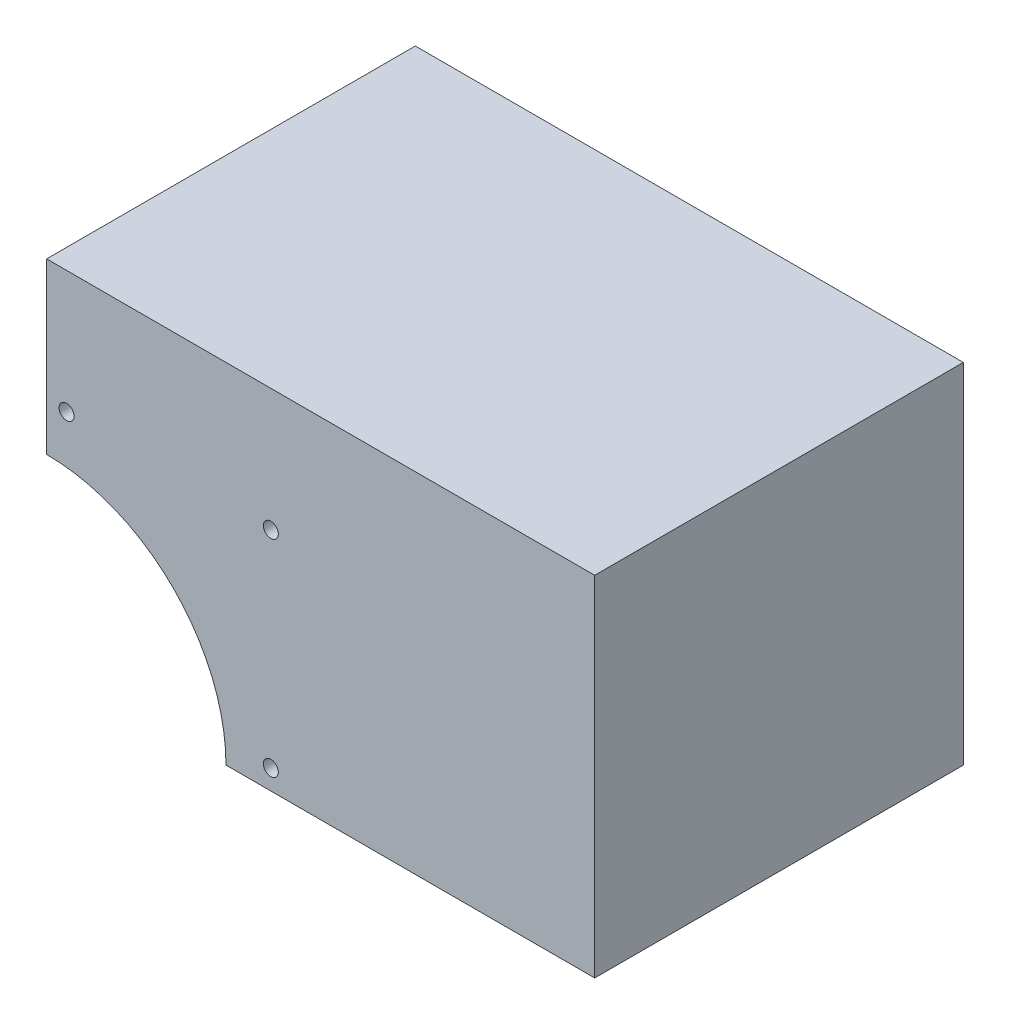
ISO-10303-21;
HEADER;
FILE_DESCRIPTION(('STEP AP214'),'2;1');
FILE_NAME('part.step','',(''),(''),'','','');
FILE_SCHEMA(('AUTOMOTIVE_DESIGN { 1 0 10303 214 1 1 1 1 }'));
ENDSEC;
DATA;
#1=APPLICATION_CONTEXT('core data for automotive mechanical design processes');
#2=APPLICATION_PROTOCOL_DEFINITION('international standard','automotive_design',2000,#1);
#3=PRODUCT_CONTEXT('',#1,'mechanical');
#4=PRODUCT('Part','Part','',(#3));
#5=PRODUCT_RELATED_PRODUCT_CATEGORY('part','',(#4));
#6=PRODUCT_DEFINITION_FORMATION('','',#4);
#7=PRODUCT_DEFINITION_CONTEXT('part definition',#1,'design');
#8=PRODUCT_DEFINITION('design','',#6,#7);
#9=PRODUCT_DEFINITION_SHAPE('','',#8);
#10=(LENGTH_UNIT() NAMED_UNIT(*) SI_UNIT(.MILLI.,.METRE.));
#11=(NAMED_UNIT(*) PLANE_ANGLE_UNIT() SI_UNIT($,.RADIAN.));
#12=(NAMED_UNIT(*) SI_UNIT($,.STERADIAN.) SOLID_ANGLE_UNIT());
#13=UNCERTAINTY_MEASURE_WITH_UNIT(LENGTH_MEASURE(1.E-05),#10,'distance_accuracy_value','');
#14=(GEOMETRIC_REPRESENTATION_CONTEXT(3) GLOBAL_UNCERTAINTY_ASSIGNED_CONTEXT((#13)) GLOBAL_UNIT_ASSIGNED_CONTEXT((#10,
#11,#12)) REPRESENTATION_CONTEXT('',''));
#15=CARTESIAN_POINT('',(0.,0.,0.));
#16=DIRECTION('',(0.,0.,1.));
#17=DIRECTION('',(1.,0.,0.));
#18=AXIS2_PLACEMENT_3D('',#15,#16,#17);
#19=CARTESIAN_POINT('',(0.,0.,37.));
#20=DIRECTION('',(0.,1.,0.));
#21=DIRECTION('',(0.,0.,1.));
#22=AXIS2_PLACEMENT_3D('',#19,#20,#21);
#23=PLANE('',#22);
#24=DIRECTION('',(1.,0.,0.));
#25=VECTOR('',#24,1.);
#26=CARTESIAN_POINT('',(0.,0.,37.));
#27=LINE('',#26,#25);
#28=CARTESIAN_POINT('',(18.,0.,37.));
#29=VERTEX_POINT('',#28);
#30=CARTESIAN_POINT('',(55.,0.,37.));
#31=VERTEX_POINT('',#30);
#32=EDGE_CURVE('E183',#29,#31,#27,.T.);
#33=ORIENTED_EDGE('',*,*,#32,.F.);
#34=DIRECTION('',(0.,0.,1.));
#35=VECTOR('',#34,1.);
#36=CARTESIAN_POINT('',(18.,0.,0.));
#37=LINE('',#36,#35);
#38=CARTESIAN_POINT('',(18.,0.,36.));
#39=VERTEX_POINT('',#38);
#40=EDGE_CURVE('E155',#29,#39,#37,.F.);
#41=ORIENTED_EDGE('',*,*,#40,.T.);
#42=DIRECTION('',(1.,0.,0.));
#43=VECTOR('',#42,1.);
#44=CARTESIAN_POINT('',(0.,0.,36.));
#45=LINE('',#44,#43);
#46=CARTESIAN_POINT('',(20.75,0.,36.));
#47=VERTEX_POINT('',#46);
#48=EDGE_CURVE('E250',#39,#47,#45,.T.);
#49=ORIENTED_EDGE('',*,*,#48,.T.);
#50=DIRECTION('',(0.,0.,-1.));
#51=VECTOR('',#50,1.);
#52=CARTESIAN_POINT('',(20.75,0.,0.));
#53=LINE('',#52,#51);
#54=CARTESIAN_POINT('',(20.75,0.,34.5));
#55=VERTEX_POINT('',#54);
#56=EDGE_CURVE('E153',#47,#55,#53,.T.);
#57=ORIENTED_EDGE('',*,*,#56,.T.);
#58=DIRECTION('',(-1.,0.,0.));
#59=VECTOR('',#58,1.);
#60=CARTESIAN_POINT('',(0.,0.,34.5));
#61=LINE('',#60,#59);
#62=CARTESIAN_POINT('',(26.,0.,34.5));
#63=VERTEX_POINT('',#62);
#64=EDGE_CURVE('E219',#63,#55,#61,.T.);
#65=ORIENTED_EDGE('',*,*,#64,.F.);
#66=DIRECTION('',(0.,0.,1.));
#67=VECTOR('',#66,1.);
#68=CARTESIAN_POINT('',(26.,0.,34.5));
#69=LINE('',#68,#67);
#70=CARTESIAN_POINT('',(26.,0.,2.5));
#71=VERTEX_POINT('',#70);
#72=EDGE_CURVE('E225',#71,#63,#69,.T.);
#73=ORIENTED_EDGE('',*,*,#72,.F.);
#74=DIRECTION('',(1.,0.,0.));
#75=VECTOR('',#74,1.);
#76=CARTESIAN_POINT('',(0.,0.,2.5));
#77=LINE('',#76,#75);
#78=CARTESIAN_POINT('',(18.,0.,2.5));
#79=VERTEX_POINT('',#78);
#80=EDGE_CURVE('E152',#79,#71,#77,.T.);
#81=ORIENTED_EDGE('',*,*,#80,.F.);
#82=CARTESIAN_POINT('',(18.,0.,0.));
#83=VERTEX_POINT('',#82);
#84=EDGE_CURVE('E52',#79,#83,#37,.F.);
#85=ORIENTED_EDGE('',*,*,#84,.T.);
#86=DIRECTION('',(1.,0.,0.));
#87=VECTOR('',#86,1.);
#88=CARTESIAN_POINT('',(0.,0.,0.));
#89=LINE('',#88,#87);
#90=CARTESIAN_POINT('',(55.,0.,0.));
#91=VERTEX_POINT('',#90);
#92=EDGE_CURVE('E149',#83,#91,#89,.T.);
#93=ORIENTED_EDGE('',*,*,#92,.T.);
#94=DIRECTION('',(0.,0.,-1.));
#95=VECTOR('',#94,1.);
#96=CARTESIAN_POINT('',(55.,0.,37.));
#97=LINE('',#96,#95);
#98=EDGE_CURVE('E45',#31,#91,#97,.T.);
#99=ORIENTED_EDGE('',*,*,#98,.F.);
#100=EDGE_LOOP('',(#33,#41,#49,#57,#65,#73,#81,#85,#93,#99));
#101=FACE_BOUND('',#100,.T.);
#102=ADVANCED_FACE('F37',(#101),#23,.F.);
#103=CARTESIAN_POINT('',(0.,76.2310562561766,34.5));
#104=DIRECTION('',(0.,0.,1.));
#105=DIRECTION('',(1.,0.,0.));
#106=AXIS2_PLACEMENT_3D('',#103,#104,#105);
#107=PLANE('',#106);
#108=CARTESIAN_POINT('',(22.5,2.,34.5));
#109=DIRECTION('',(0.,0.,1.));
#110=DIRECTION('',(1.,0.,0.));
#111=AXIS2_PLACEMENT_3D('',#108,#109,#110);
#112=CIRCLE('',#111,0.750000000000002);
#113=CARTESIAN_POINT('',(23.25,2.,34.5));
#114=VERTEX_POINT('',#113);
#115=EDGE_CURVE('E236',#114,#114,#112,.F.);
#116=ORIENTED_EDGE('',*,*,#115,.F.);
#117=EDGE_LOOP('',(#116));
#118=FACE_BOUND('',#117,.T.);
#119=CARTESIAN_POINT('',(22.5,22.7,34.5));
#120=DIRECTION('',(0.,0.,1.));
#121=DIRECTION('',(1.,0.,0.));
#122=AXIS2_PLACEMENT_3D('',#119,#120,#121);
#123=CIRCLE('',#122,0.750000000000002);
#124=CARTESIAN_POINT('',(23.25,22.7,34.5));
#125=VERTEX_POINT('',#124);
#126=EDGE_CURVE('E292',#125,#125,#123,.F.);
#127=ORIENTED_EDGE('',*,*,#126,.F.);
#128=EDGE_LOOP('',(#127));
#129=FACE_BOUND('',#128,.T.);
#130=CARTESIAN_POINT('',(2.,22.7,34.5));
#131=DIRECTION('',(0.,0.,1.));
#132=DIRECTION('',(1.,0.,0.));
#133=AXIS2_PLACEMENT_3D('',#130,#131,#132);
#134=CIRCLE('',#133,0.75);
#135=CARTESIAN_POINT('',(2.75,22.7,34.5));
#136=VERTEX_POINT('',#135);
#137=EDGE_CURVE('E298',#136,#136,#134,.F.);
#138=ORIENTED_EDGE('',*,*,#137,.F.);
#139=EDGE_LOOP('',(#138));
#140=FACE_BOUND('',#139,.T.);
#141=DIRECTION('',(0.,-1.,0.));
#142=VECTOR('',#141,1.);
#143=CARTESIAN_POINT('',(3.75,27.,34.5));
#144=LINE('',#143,#142);
#145=CARTESIAN_POINT('',(3.75,27.,34.5));
#146=VERTEX_POINT('',#145);
#147=CARTESIAN_POINT('',(3.75,17.6050418914583,34.5));
#148=VERTEX_POINT('',#147);
#149=EDGE_CURVE('E264',#146,#148,#144,.T.);
#150=ORIENTED_EDGE('',*,*,#149,.T.);
#151=CARTESIAN_POINT('',(0.,0.,34.5));
#152=DIRECTION('',(0.,0.,1.));
#153=DIRECTION('',(1.,0.,0.));
#154=AXIS2_PLACEMENT_3D('',#151,#152,#153);
#155=CIRCLE('',#154,18.);
#156=CARTESIAN_POINT('',(0.,18.,34.5));
#157=VERTEX_POINT('',#156);
#158=EDGE_CURVE('E209',#148,#157,#155,.T.);
#159=ORIENTED_EDGE('',*,*,#158,.T.);
#160=DIRECTION('',(0.,-1.,0.));
#161=VECTOR('',#160,1.);
#162=CARTESIAN_POINT('',(0.,76.2310562561766,34.5));
#163=LINE('',#162,#161);
#164=CARTESIAN_POINT('',(0.,32.,34.5));
#165=VERTEX_POINT('',#164);
#166=EDGE_CURVE('E204',#165,#157,#163,.T.);
#167=ORIENTED_EDGE('',*,*,#166,.F.);
#168=DIRECTION('',(1.,0.,0.));
#169=VECTOR('',#168,1.);
#170=CARTESIAN_POINT('',(0.,32.,34.5));
#171=LINE('',#170,#169);
#172=CARTESIAN_POINT('',(26.,32.,34.5));
#173=VERTEX_POINT('',#172);
#174=EDGE_CURVE('E229',#165,#173,#171,.T.);
#175=ORIENTED_EDGE('',*,*,#174,.T.);
#176=DIRECTION('',(0.,-1.,0.));
#177=VECTOR('',#176,1.);
#178=CARTESIAN_POINT('',(26.,76.2310562561766,34.5));
#179=LINE('',#178,#177);
#180=EDGE_CURVE('E222',#173,#63,#179,.T.);
#181=ORIENTED_EDGE('',*,*,#180,.T.);
#182=ORIENTED_EDGE('',*,*,#64,.T.);
#183=DIRECTION('',(0.,-1.,0.));
#184=VECTOR('',#183,1.);
#185=CARTESIAN_POINT('',(20.75,27.,34.5));
#186=LINE('',#185,#184);
#187=CARTESIAN_POINT('',(20.75,27.,34.5));
#188=VERTEX_POINT('',#187);
#189=EDGE_CURVE('E261',#188,#55,#186,.T.);
#190=ORIENTED_EDGE('',*,*,#189,.F.);
#191=DIRECTION('',(1.,0.,0.));
#192=VECTOR('',#191,1.);
#193=CARTESIAN_POINT('',(0.,27.,34.5));
#194=LINE('',#193,#192);
#195=EDGE_CURVE('E258',#146,#188,#194,.T.);
#196=ORIENTED_EDGE('',*,*,#195,.F.);
#197=EDGE_LOOP('',(#150,#159,#167,#175,#181,#182,#190,#196));
#198=FACE_BOUND('',#197,.T.);
#199=ADVANCED_FACE('F242',(#118,#129,#140,#198),#107,.F.);
#200=CARTESIAN_POINT('',(0.,0.,37.));
#201=DIRECTION('',(1.,0.,0.));
#202=DIRECTION('',(0.,0.,-1.));
#203=AXIS2_PLACEMENT_3D('',#200,#201,#202);
#204=PLANE('',#203);
#205=DIRECTION('',(0.,-1.,0.));
#206=VECTOR('',#205,1.);
#207=CARTESIAN_POINT('',(0.,0.,0.));
#208=LINE('',#207,#206);
#209=CARTESIAN_POINT('',(0.,35.,0.));
#210=VERTEX_POINT('',#209);
#211=CARTESIAN_POINT('',(0.,18.,0.));
#212=VERTEX_POINT('',#211);
#213=EDGE_CURVE('E161',#210,#212,#208,.T.);
#214=ORIENTED_EDGE('',*,*,#213,.T.);
#215=DIRECTION('',(0.,0.,1.));
#216=VECTOR('',#215,1.);
#217=CARTESIAN_POINT('',(0.,18.,0.));
#218=LINE('',#217,#216);
#219=CARTESIAN_POINT('',(0.,18.,2.5));
#220=VERTEX_POINT('',#219);
#221=EDGE_CURVE('E138',#212,#220,#218,.T.);
#222=ORIENTED_EDGE('',*,*,#221,.T.);
#223=DIRECTION('',(0.,-1.,0.));
#224=VECTOR('',#223,1.);
#225=CARTESIAN_POINT('',(0.,76.2310562561766,2.5));
#226=LINE('',#225,#224);
#227=CARTESIAN_POINT('',(0.,32.,2.5));
#228=VERTEX_POINT('',#227);
#229=EDGE_CURVE('E212',#228,#220,#226,.T.);
#230=ORIENTED_EDGE('',*,*,#229,.F.);
#231=DIRECTION('',(0.,0.,1.));
#232=VECTOR('',#231,1.);
#233=CARTESIAN_POINT('',(0.,32.,34.5));
#234=LINE('',#233,#232);
#235=EDGE_CURVE('E228',#228,#165,#234,.T.);
#236=ORIENTED_EDGE('',*,*,#235,.T.);
#237=ORIENTED_EDGE('',*,*,#166,.T.);
#238=CARTESIAN_POINT('',(0.,18.,37.));
#239=VERTEX_POINT('',#238);
#240=EDGE_CURVE('E201',#157,#239,#218,.T.);
#241=ORIENTED_EDGE('',*,*,#240,.T.);
#242=DIRECTION('',(0.,-1.,0.));
#243=VECTOR('',#242,1.);
#244=CARTESIAN_POINT('',(0.,0.,37.));
#245=LINE('',#244,#243);
#246=CARTESIAN_POINT('',(0.,35.,37.));
#247=VERTEX_POINT('',#246);
#248=EDGE_CURVE('E170',#247,#239,#245,.T.);
#249=ORIENTED_EDGE('',*,*,#248,.F.);
#250=DIRECTION('',(0.,0.,-1.));
#251=VECTOR('',#250,1.);
#252=CARTESIAN_POINT('',(0.,35.,37.));
#253=LINE('',#252,#251);
#254=EDGE_CURVE('E171',#247,#210,#253,.T.);
#255=ORIENTED_EDGE('',*,*,#254,.T.);
#256=EDGE_LOOP('',(#214,#222,#230,#236,#237,#241,#249,#255));
#257=FACE_BOUND('',#256,.T.);
#258=ADVANCED_FACE('F39',(#257),#204,.F.);
#259=CARTESIAN_POINT('',(55.,0.,37.));
#260=DIRECTION('',(-1.,0.,0.));
#261=DIRECTION('',(0.,0.,1.));
#262=AXIS2_PLACEMENT_3D('',#259,#260,#261);
#263=PLANE('',#262);
#264=DIRECTION('',(0.,1.,0.));
#265=VECTOR('',#264,1.);
#266=CARTESIAN_POINT('',(55.,0.,0.));
#267=LINE('',#266,#265);
#268=CARTESIAN_POINT('',(55.,35.,0.));
#269=VERTEX_POINT('',#268);
#270=EDGE_CURVE('E160',#91,#269,#267,.T.);
#271=ORIENTED_EDGE('',*,*,#270,.T.);
#272=DIRECTION('',(0.,0.,-1.));
#273=VECTOR('',#272,1.);
#274=CARTESIAN_POINT('',(55.,35.,37.));
#275=LINE('',#274,#273);
#276=CARTESIAN_POINT('',(55.,35.,37.));
#277=VERTEX_POINT('',#276);
#278=EDGE_CURVE('E174',#277,#269,#275,.T.);
#279=ORIENTED_EDGE('',*,*,#278,.F.);
#280=DIRECTION('',(0.,1.,0.));
#281=VECTOR('',#280,1.);
#282=CARTESIAN_POINT('',(55.,0.,37.));
#283=LINE('',#282,#281);
#284=EDGE_CURVE('E181',#31,#277,#283,.T.);
#285=ORIENTED_EDGE('',*,*,#284,.F.);
#286=ORIENTED_EDGE('',*,*,#98,.T.);
#287=EDGE_LOOP('',(#271,#279,#285,#286));
#288=FACE_BOUND('',#287,.T.);
#289=ADVANCED_FACE('F179',(#288),#263,.F.);
#290=CARTESIAN_POINT('',(0.,35.,37.));
#291=DIRECTION('',(0.,-1.,0.));
#292=DIRECTION('',(0.,0.,-1.));
#293=AXIS2_PLACEMENT_3D('',#290,#291,#292);
#294=PLANE('',#293);
#295=DIRECTION('',(-1.,0.,0.));
#296=VECTOR('',#295,1.);
#297=CARTESIAN_POINT('',(0.,35.,0.));
#298=LINE('',#297,#296);
#299=EDGE_CURVE('E163',#269,#210,#298,.T.);
#300=ORIENTED_EDGE('',*,*,#299,.T.);
#301=ORIENTED_EDGE('',*,*,#254,.F.);
#302=DIRECTION('',(-1.,0.,0.));
#303=VECTOR('',#302,1.);
#304=CARTESIAN_POINT('',(0.,35.,37.));
#305=LINE('',#304,#303);
#306=EDGE_CURVE('E175',#277,#247,#305,.T.);
#307=ORIENTED_EDGE('',*,*,#306,.F.);
#308=ORIENTED_EDGE('',*,*,#278,.T.);
#309=EDGE_LOOP('',(#300,#301,#307,#308));
#310=FACE_BOUND('',#309,.T.);
#311=ADVANCED_FACE('F197',(#310),#294,.F.);
#312=CARTESIAN_POINT('',(0.,0.,37.));
#313=DIRECTION('',(0.,0.,-1.));
#314=DIRECTION('',(-1.,0.,0.));
#315=AXIS2_PLACEMENT_3D('',#312,#313,#314);
#316=PLANE('',#315);
#317=CARTESIAN_POINT('',(2.,22.7,37.));
#318=DIRECTION('',(0.,0.,1.));
#319=DIRECTION('',(1.,0.,0.));
#320=AXIS2_PLACEMENT_3D('',#317,#318,#319);
#321=CIRCLE('',#320,0.75);
#322=CARTESIAN_POINT('',(2.75,22.7,37.));
#323=VERTEX_POINT('',#322);
#324=EDGE_CURVE('E288',#323,#323,#321,.T.);
#325=ORIENTED_EDGE('',*,*,#324,.F.);
#326=EDGE_LOOP('',(#325));
#327=FACE_BOUND('',#326,.T.);
#328=CARTESIAN_POINT('',(22.5,22.7,37.));
#329=DIRECTION('',(0.,0.,1.));
#330=DIRECTION('',(1.,0.,0.));
#331=AXIS2_PLACEMENT_3D('',#328,#329,#330);
#332=CIRCLE('',#331,0.750000000000002);
#333=CARTESIAN_POINT('',(23.25,22.7,37.));
#334=VERTEX_POINT('',#333);
#335=EDGE_CURVE('E295',#334,#334,#332,.T.);
#336=ORIENTED_EDGE('',*,*,#335,.F.);
#337=EDGE_LOOP('',(#336));
#338=FACE_BOUND('',#337,.T.);
#339=CARTESIAN_POINT('',(22.5,2.,37.));
#340=DIRECTION('',(0.,0.,1.));
#341=DIRECTION('',(1.,0.,0.));
#342=AXIS2_PLACEMENT_3D('',#339,#340,#341);
#343=CIRCLE('',#342,0.750000000000002);
#344=CARTESIAN_POINT('',(23.25,2.,37.));
#345=VERTEX_POINT('',#344);
#346=EDGE_CURVE('E289',#345,#345,#343,.T.);
#347=ORIENTED_EDGE('',*,*,#346,.F.);
#348=EDGE_LOOP('',(#347));
#349=FACE_BOUND('',#348,.T.);
#350=ORIENTED_EDGE('',*,*,#248,.T.);
#351=CARTESIAN_POINT('',(0.,0.,37.));
#352=DIRECTION('',(0.,0.,1.));
#353=DIRECTION('',(1.,0.,0.));
#354=AXIS2_PLACEMENT_3D('',#351,#352,#353);
#355=CIRCLE('',#354,18.);
#356=EDGE_CURVE('E143',#29,#239,#355,.T.);
#357=ORIENTED_EDGE('',*,*,#356,.F.);
#358=ORIENTED_EDGE('',*,*,#32,.T.);
#359=ORIENTED_EDGE('',*,*,#284,.T.);
#360=ORIENTED_EDGE('',*,*,#306,.T.);
#361=EDGE_LOOP('',(#350,#357,#358,#359,#360));
#362=FACE_BOUND('',#361,.T.);
#363=ADVANCED_FACE('F194',(#327,#338,#349,#362),#316,.F.);
#364=CARTESIAN_POINT('',(0.,0.,0.));
#365=DIRECTION('',(0.,0.,-1.));
#366=DIRECTION('',(-1.,0.,0.));
#367=AXIS2_PLACEMENT_3D('',#364,#365,#366);
#368=PLANE('',#367);
#369=CARTESIAN_POINT('',(0.,0.,0.));
#370=DIRECTION('',(0.,0.,1.));
#371=DIRECTION('',(1.,0.,0.));
#372=AXIS2_PLACEMENT_3D('',#369,#370,#371);
#373=CIRCLE('',#372,18.);
#374=EDGE_CURVE('E135',#83,#212,#373,.T.);
#375=ORIENTED_EDGE('',*,*,#374,.T.);
#376=ORIENTED_EDGE('',*,*,#213,.F.);
#377=ORIENTED_EDGE('',*,*,#299,.F.);
#378=ORIENTED_EDGE('',*,*,#270,.F.);
#379=ORIENTED_EDGE('',*,*,#92,.F.);
#380=EDGE_LOOP('',(#375,#376,#377,#378,#379));
#381=FACE_BOUND('',#380,.T.);
#382=CARTESIAN_POINT('',(22.5,26.45,0.));
#383=DIRECTION('',(0.,0.,-1.));
#384=DIRECTION('',(-1.,0.,0.));
#385=AXIS2_PLACEMENT_3D('',#382,#383,#384);
#386=CIRCLE('',#385,0.750000000000002);
#387=CARTESIAN_POINT('',(21.75,26.45,0.));
#388=VERTEX_POINT('',#387);
#389=EDGE_CURVE('E275',#388,#388,#386,.T.);
#390=ORIENTED_EDGE('',*,*,#389,.F.);
#391=EDGE_LOOP('',(#390));
#392=FACE_BOUND('',#391,.T.);
#393=CARTESIAN_POINT('',(2.,26.45,0.));
#394=DIRECTION('',(0.,0.,-1.));
#395=DIRECTION('',(-1.,0.,0.));
#396=AXIS2_PLACEMENT_3D('',#393,#394,#395);
#397=CIRCLE('',#396,0.75);
#398=CARTESIAN_POINT('',(1.25,26.45,0.));
#399=VERTEX_POINT('',#398);
#400=EDGE_CURVE('E274',#399,#399,#397,.T.);
#401=ORIENTED_EDGE('',*,*,#400,.F.);
#402=EDGE_LOOP('',(#401));
#403=FACE_BOUND('',#402,.T.);
#404=CARTESIAN_POINT('',(22.5,2.,0.));
#405=DIRECTION('',(0.,0.,-1.));
#406=DIRECTION('',(-1.,0.,0.));
#407=AXIS2_PLACEMENT_3D('',#404,#405,#406);
#408=CIRCLE('',#407,0.750000000000002);
#409=CARTESIAN_POINT('',(21.75,2.,0.));
#410=VERTEX_POINT('',#409);
#411=EDGE_CURVE('E278',#410,#410,#408,.T.);
#412=ORIENTED_EDGE('',*,*,#411,.F.);
#413=EDGE_LOOP('',(#412));
#414=FACE_BOUND('',#413,.T.);
#415=ADVANCED_FACE('F157',(#381,#392,#403,#414),#368,.T.);
#416=CARTESIAN_POINT('',(26.,76.2310562561766,34.5));
#417=DIRECTION('',(1.,0.,0.));
#418=DIRECTION('',(0.,0.,-1.));
#419=AXIS2_PLACEMENT_3D('',#416,#417,#418);
#420=PLANE('',#419);
#421=DIRECTION('',(0.,0.,-1.));
#422=VECTOR('',#421,1.);
#423=CARTESIAN_POINT('',(26.,32.,34.5));
#424=LINE('',#423,#422);
#425=CARTESIAN_POINT('',(26.,32.,2.5));
#426=VERTEX_POINT('',#425);
#427=EDGE_CURVE('E231',#173,#426,#424,.T.);
#428=ORIENTED_EDGE('',*,*,#427,.T.);
#429=DIRECTION('',(0.,-1.,0.));
#430=VECTOR('',#429,1.);
#431=CARTESIAN_POINT('',(26.,76.2310562561766,2.5));
#432=LINE('',#431,#430);
#433=EDGE_CURVE('E218',#426,#71,#432,.T.);
#434=ORIENTED_EDGE('',*,*,#433,.T.);
#435=ORIENTED_EDGE('',*,*,#72,.T.);
#436=ORIENTED_EDGE('',*,*,#180,.F.);
#437=EDGE_LOOP('',(#428,#434,#435,#436));
#438=FACE_BOUND('',#437,.T.);
#439=ADVANCED_FACE('F247',(#438),#420,.F.);
#440=CARTESIAN_POINT('',(0.,76.2310562561766,2.5));
#441=DIRECTION('',(0.,0.,-1.));
#442=DIRECTION('',(-1.,0.,0.));
#443=AXIS2_PLACEMENT_3D('',#440,#441,#442);
#444=PLANE('',#443);
#445=CARTESIAN_POINT('',(22.5,26.45,2.5));
#446=DIRECTION('',(0.,0.,-1.));
#447=DIRECTION('',(-1.,0.,0.));
#448=AXIS2_PLACEMENT_3D('',#445,#446,#447);
#449=CIRCLE('',#448,0.750000000000002);
#450=CARTESIAN_POINT('',(21.75,26.45,2.5));
#451=VERTEX_POINT('',#450);
#452=EDGE_CURVE('E263',#451,#451,#449,.F.);
#453=ORIENTED_EDGE('',*,*,#452,.F.);
#454=EDGE_LOOP('',(#453));
#455=FACE_BOUND('',#454,.T.);
#456=CARTESIAN_POINT('',(2.,26.45,2.5));
#457=DIRECTION('',(0.,0.,-1.));
#458=DIRECTION('',(-1.,0.,0.));
#459=AXIS2_PLACEMENT_3D('',#456,#457,#458);
#460=CIRCLE('',#459,0.75);
#461=CARTESIAN_POINT('',(1.25,26.45,2.5));
#462=VERTEX_POINT('',#461);
#463=EDGE_CURVE('E271',#462,#462,#460,.F.);
#464=ORIENTED_EDGE('',*,*,#463,.F.);
#465=EDGE_LOOP('',(#464));
#466=FACE_BOUND('',#465,.T.);
#467=CARTESIAN_POINT('',(22.5,2.,2.5));
#468=DIRECTION('',(0.,0.,-1.));
#469=DIRECTION('',(-1.,0.,0.));
#470=AXIS2_PLACEMENT_3D('',#467,#468,#469);
#471=CIRCLE('',#470,0.750000000000002);
#472=CARTESIAN_POINT('',(21.75,2.,2.5));
#473=VERTEX_POINT('',#472);
#474=EDGE_CURVE('E285',#473,#473,#471,.F.);
#475=ORIENTED_EDGE('',*,*,#474,.F.);
#476=EDGE_LOOP('',(#475));
#477=FACE_BOUND('',#476,.T.);
#478=ORIENTED_EDGE('',*,*,#229,.T.);
#479=CARTESIAN_POINT('',(0.,0.,2.5));
#480=DIRECTION('',(0.,0.,-1.));
#481=DIRECTION('',(-1.,0.,0.));
#482=AXIS2_PLACEMENT_3D('',#479,#480,#481);
#483=CIRCLE('',#482,18.);
#484=EDGE_CURVE('E206',#220,#79,#483,.T.);
#485=ORIENTED_EDGE('',*,*,#484,.T.);
#486=ORIENTED_EDGE('',*,*,#80,.T.);
#487=ORIENTED_EDGE('',*,*,#433,.F.);
#488=DIRECTION('',(-1.,0.,0.));
#489=VECTOR('',#488,1.);
#490=CARTESIAN_POINT('',(0.,32.,2.5));
#491=LINE('',#490,#489);
#492=EDGE_CURVE('E165',#426,#228,#491,.T.);
#493=ORIENTED_EDGE('',*,*,#492,.T.);
#494=EDGE_LOOP('',(#478,#485,#486,#487,#493));
#495=FACE_BOUND('',#494,.T.);
#496=ADVANCED_FACE('F214',(#455,#466,#477,#495),#444,.F.);
#497=CARTESIAN_POINT('',(0.,32.,37.));
#498=DIRECTION('',(0.,-1.,0.));
#499=DIRECTION('',(0.,0.,-1.));
#500=AXIS2_PLACEMENT_3D('',#497,#498,#499);
#501=PLANE('',#500);
#502=ORIENTED_EDGE('',*,*,#235,.F.);
#503=ORIENTED_EDGE('',*,*,#492,.F.);
#504=ORIENTED_EDGE('',*,*,#427,.F.);
#505=ORIENTED_EDGE('',*,*,#174,.F.);
#506=EDGE_LOOP('',(#502,#503,#504,#505));
#507=FACE_BOUND('',#506,.T.);
#508=ADVANCED_FACE('F305',(#507),#501,.T.);
#509=CARTESIAN_POINT('',(22.5,2.,-0.001000000000001));
#510=DIRECTION('',(0.,0.,1.));
#511=DIRECTION('',(1.,0.,0.));
#512=AXIS2_PLACEMENT_3D('',#509,#510,#511);
#513=CYLINDRICAL_SURFACE('',#512,0.750000000000002);
#514=ORIENTED_EDGE('',*,*,#346,.T.);
#515=EDGE_LOOP('',(#514));
#516=FACE_BOUND('',#515,.T.);
#517=ORIENTED_EDGE('',*,*,#115,.T.);
#518=EDGE_LOOP('',(#517));
#519=FACE_BOUND('',#518,.T.);
#520=ADVANCED_FACE('F359',(#516,#519),#513,.F.);
#521=CARTESIAN_POINT('',(22.5,22.7,-0.001000000000001));
#522=DIRECTION('',(0.,0.,1.));
#523=DIRECTION('',(1.,0.,0.));
#524=AXIS2_PLACEMENT_3D('',#521,#522,#523);
#525=CYLINDRICAL_SURFACE('',#524,0.750000000000002);
#526=ORIENTED_EDGE('',*,*,#335,.T.);
#527=EDGE_LOOP('',(#526));
#528=FACE_BOUND('',#527,.T.);
#529=ORIENTED_EDGE('',*,*,#126,.T.);
#530=EDGE_LOOP('',(#529));
#531=FACE_BOUND('',#530,.T.);
#532=ADVANCED_FACE('F364',(#528,#531),#525,.F.);
#533=CARTESIAN_POINT('',(2.,22.7,-0.001000000000001));
#534=DIRECTION('',(0.,0.,1.));
#535=DIRECTION('',(1.,0.,0.));
#536=AXIS2_PLACEMENT_3D('',#533,#534,#535);
#537=CYLINDRICAL_SURFACE('',#536,0.75);
#538=ORIENTED_EDGE('',*,*,#324,.T.);
#539=EDGE_LOOP('',(#538));
#540=FACE_BOUND('',#539,.T.);
#541=ORIENTED_EDGE('',*,*,#137,.T.);
#542=EDGE_LOOP('',(#541));
#543=FACE_BOUND('',#542,.T.);
#544=ADVANCED_FACE('F360',(#540,#543),#537,.F.);
#545=CARTESIAN_POINT('',(22.5,2.,37.001));
#546=DIRECTION('',(0.,0.,-1.));
#547=DIRECTION('',(-1.,0.,0.));
#548=AXIS2_PLACEMENT_3D('',#545,#546,#547);
#549=CYLINDRICAL_SURFACE('',#548,0.750000000000002);
#550=ORIENTED_EDGE('',*,*,#411,.T.);
#551=EDGE_LOOP('',(#550));
#552=FACE_BOUND('',#551,.T.);
#553=ORIENTED_EDGE('',*,*,#474,.T.);
#554=EDGE_LOOP('',(#553));
#555=FACE_BOUND('',#554,.T.);
#556=ADVANCED_FACE('F363',(#552,#555),#549,.F.);
#557=CARTESIAN_POINT('',(2.,26.45,37.001));
#558=DIRECTION('',(0.,0.,-1.));
#559=DIRECTION('',(-1.,0.,0.));
#560=AXIS2_PLACEMENT_3D('',#557,#558,#559);
#561=CYLINDRICAL_SURFACE('',#560,0.75);
#562=ORIENTED_EDGE('',*,*,#400,.T.);
#563=EDGE_LOOP('',(#562));
#564=FACE_BOUND('',#563,.T.);
#565=ORIENTED_EDGE('',*,*,#463,.T.);
#566=EDGE_LOOP('',(#565));
#567=FACE_BOUND('',#566,.T.);
#568=ADVANCED_FACE('F374',(#564,#567),#561,.F.);
#569=CARTESIAN_POINT('',(22.5,26.45,37.001));
#570=DIRECTION('',(0.,0.,-1.));
#571=DIRECTION('',(-1.,0.,0.));
#572=AXIS2_PLACEMENT_3D('',#569,#570,#571);
#573=CYLINDRICAL_SURFACE('',#572,0.750000000000002);
#574=ORIENTED_EDGE('',*,*,#389,.T.);
#575=EDGE_LOOP('',(#574));
#576=FACE_BOUND('',#575,.T.);
#577=ORIENTED_EDGE('',*,*,#452,.T.);
#578=EDGE_LOOP('',(#577));
#579=FACE_BOUND('',#578,.T.);
#580=ADVANCED_FACE('F376',(#576,#579),#573,.F.);
#581=CARTESIAN_POINT('',(20.75,27.,0.));
#582=DIRECTION('',(-1.,0.,0.));
#583=DIRECTION('',(0.,0.,1.));
#584=AXIS2_PLACEMENT_3D('',#581,#582,#583);
#585=PLANE('',#584);
#586=ORIENTED_EDGE('',*,*,#56,.F.);
#587=DIRECTION('',(0.,-1.,0.));
#588=VECTOR('',#587,1.);
#589=CARTESIAN_POINT('',(20.75,27.,36.));
#590=LINE('',#589,#588);
#591=CARTESIAN_POINT('',(20.75,27.,36.));
#592=VERTEX_POINT('',#591);
#593=EDGE_CURVE('E269',#592,#47,#590,.T.);
#594=ORIENTED_EDGE('',*,*,#593,.F.);
#595=DIRECTION('',(0.,0.,-1.));
#596=VECTOR('',#595,1.);
#597=CARTESIAN_POINT('',(20.75,27.,0.));
#598=LINE('',#597,#596);
#599=EDGE_CURVE('E255',#592,#188,#598,.T.);
#600=ORIENTED_EDGE('',*,*,#599,.T.);
#601=ORIENTED_EDGE('',*,*,#189,.T.);
#602=EDGE_LOOP('',(#586,#594,#600,#601));
#603=FACE_BOUND('',#602,.T.);
#604=ADVANCED_FACE('F325',(#603),#585,.T.);
#605=CARTESIAN_POINT('',(3.75,27.,0.));
#606=DIRECTION('',(-1.,0.,0.));
#607=DIRECTION('',(0.,0.,1.));
#608=AXIS2_PLACEMENT_3D('',#605,#606,#607);
#609=PLANE('',#608);
#610=DIRECTION('',(0.,-1.,0.));
#611=VECTOR('',#610,1.);
#612=CARTESIAN_POINT('',(3.75,27.,36.));
#613=LINE('',#612,#611);
#614=CARTESIAN_POINT('',(3.75,27.,36.));
#615=VERTEX_POINT('',#614);
#616=CARTESIAN_POINT('',(3.75,17.6050418914583,36.));
#617=VERTEX_POINT('',#616);
#618=EDGE_CURVE('E266',#615,#617,#613,.T.);
#619=ORIENTED_EDGE('',*,*,#618,.T.);
#620=DIRECTION('',(0.,0.,1.));
#621=VECTOR('',#620,1.);
#622=CARTESIAN_POINT('',(3.75,17.6050418914583,0.));
#623=LINE('',#622,#621);
#624=EDGE_CURVE('E59',#617,#148,#623,.F.);
#625=ORIENTED_EDGE('',*,*,#624,.T.);
#626=ORIENTED_EDGE('',*,*,#149,.F.);
#627=DIRECTION('',(0.,0.,-1.));
#628=VECTOR('',#627,1.);
#629=CARTESIAN_POINT('',(3.75,27.,0.));
#630=LINE('',#629,#628);
#631=EDGE_CURVE('E318',#615,#146,#630,.T.);
#632=ORIENTED_EDGE('',*,*,#631,.F.);
#633=EDGE_LOOP('',(#619,#625,#626,#632));
#634=FACE_BOUND('',#633,.T.);
#635=ADVANCED_FACE('F317',(#634),#609,.F.);
#636=CARTESIAN_POINT('',(0.,27.,36.));
#637=DIRECTION('',(0.,0.,-1.));
#638=DIRECTION('',(-1.,0.,0.));
#639=AXIS2_PLACEMENT_3D('',#636,#637,#638);
#640=PLANE('',#639);
#641=CARTESIAN_POINT('',(0.,0.,36.));
#642=DIRECTION('',(0.,0.,-1.));
#643=DIRECTION('',(-1.,0.,0.));
#644=AXIS2_PLACEMENT_3D('',#641,#642,#643);
#645=CIRCLE('',#644,18.);
#646=EDGE_CURVE('E12',#617,#39,#645,.T.);
#647=ORIENTED_EDGE('',*,*,#646,.F.);
#648=ORIENTED_EDGE('',*,*,#618,.F.);
#649=DIRECTION('',(1.,0.,0.));
#650=VECTOR('',#649,1.);
#651=CARTESIAN_POINT('',(0.,27.,36.));
#652=LINE('',#651,#650);
#653=EDGE_CURVE('E321',#615,#592,#652,.T.);
#654=ORIENTED_EDGE('',*,*,#653,.T.);
#655=ORIENTED_EDGE('',*,*,#593,.T.);
#656=ORIENTED_EDGE('',*,*,#48,.F.);
#657=EDGE_LOOP('',(#647,#648,#654,#655,#656));
#658=FACE_BOUND('',#657,.T.);
#659=ADVANCED_FACE('F313',(#658),#640,.T.);
#660=CARTESIAN_POINT('',(0.,27.,0.));
#661=DIRECTION('',(0.,-1.,0.));
#662=DIRECTION('',(0.,0.,-1.));
#663=AXIS2_PLACEMENT_3D('',#660,#661,#662);
#664=PLANE('',#663);
#665=ORIENTED_EDGE('',*,*,#599,.F.);
#666=ORIENTED_EDGE('',*,*,#653,.F.);
#667=ORIENTED_EDGE('',*,*,#631,.T.);
#668=ORIENTED_EDGE('',*,*,#195,.T.);
#669=EDGE_LOOP('',(#665,#666,#667,#668));
#670=FACE_BOUND('',#669,.T.);
#671=ADVANCED_FACE('F326',(#670),#664,.T.);
#672=CARTESIAN_POINT('',(0.,0.,0.));
#673=DIRECTION('',(0.,0.,1.));
#674=DIRECTION('',(1.,0.,0.));
#675=AXIS2_PLACEMENT_3D('',#672,#673,#674);
#676=CYLINDRICAL_SURFACE('',#675,18.);
#677=ORIENTED_EDGE('',*,*,#158,.F.);
#678=ORIENTED_EDGE('',*,*,#624,.F.);
#679=ORIENTED_EDGE('',*,*,#646,.T.);
#680=ORIENTED_EDGE('',*,*,#40,.F.);
#681=ORIENTED_EDGE('',*,*,#356,.T.);
#682=ORIENTED_EDGE('',*,*,#240,.F.);
#683=EDGE_LOOP('',(#677,#678,#679,#680,#681,#682));
#684=FACE_BOUND('',#683,.T.);
#685=ADVANCED_FACE('F311',(#684),#676,.F.);
#686=ORIENTED_EDGE('',*,*,#484,.F.);
#687=ORIENTED_EDGE('',*,*,#221,.F.);
#688=ORIENTED_EDGE('',*,*,#374,.F.);
#689=ORIENTED_EDGE('',*,*,#84,.F.);
#690=EDGE_LOOP('',(#686,#687,#688,#689));
#691=FACE_BOUND('',#690,.T.);
#692=ADVANCED_FACE('F136',(#691),#676,.F.);
#693=CLOSED_SHELL('',(#102,#199,#258,#289,#311,#363,#415,#439,#496,#508,#520,#532,#544,#556,
#568,#580,#604,#635,#659,#671,#685,#692));
#694=MANIFOLD_SOLID_BREP('B2',#693);
#695=ADVANCED_BREP_SHAPE_REPRESENTATION('',(#18,#694),#14);
#696=SHAPE_DEFINITION_REPRESENTATION(#9,#695);
ENDSEC;
END-ISO-10303-21;
